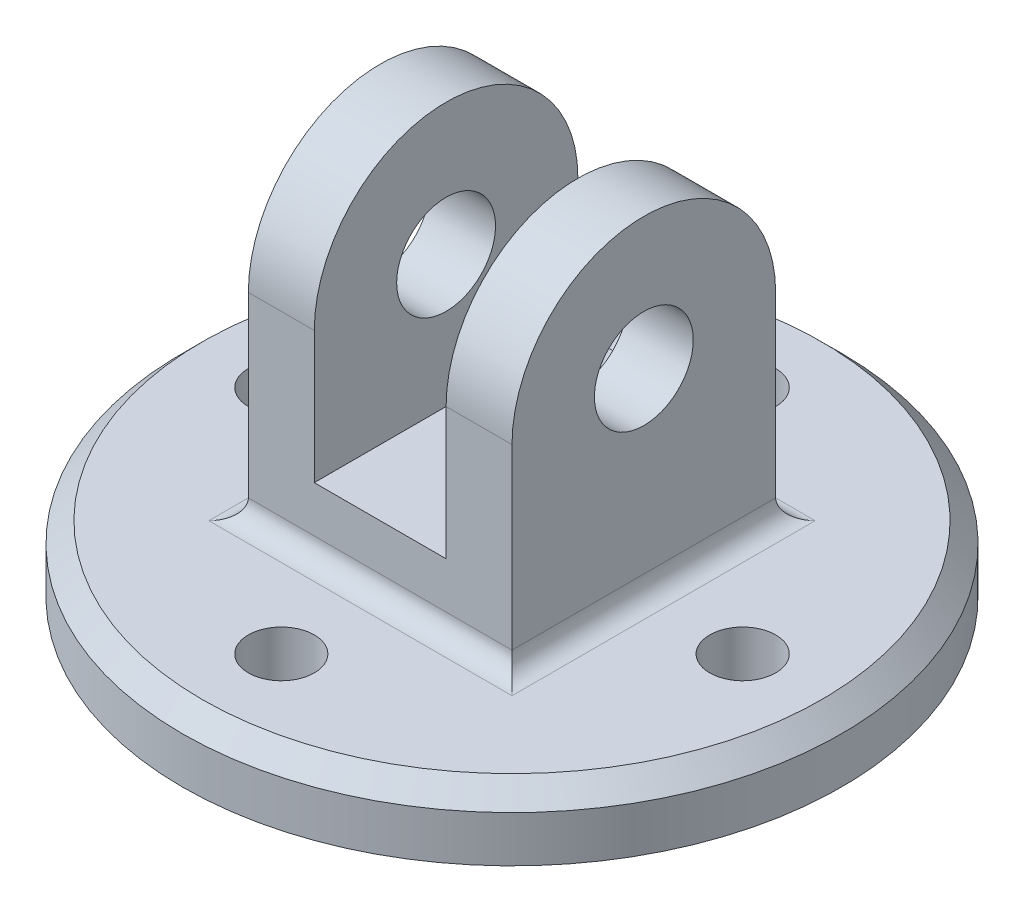
ISO-10303-21;
HEADER;
FILE_DESCRIPTION(('STEP AP214'),'2;1');
FILE_NAME('part.step','',(''),(''),'','','');
FILE_SCHEMA(('AUTOMOTIVE_DESIGN { 1 0 10303 214 1 1 1 1 }'));
ENDSEC;
DATA;
#1=APPLICATION_CONTEXT('core data for automotive mechanical design processes');
#2=APPLICATION_PROTOCOL_DEFINITION('international standard','automotive_design',2000,#1);
#3=PRODUCT_CONTEXT('',#1,'mechanical');
#4=PRODUCT('Part','Part','',(#3));
#5=PRODUCT_RELATED_PRODUCT_CATEGORY('part','',(#4));
#6=PRODUCT_DEFINITION_FORMATION('','',#4);
#7=PRODUCT_DEFINITION_CONTEXT('part definition',#1,'design');
#8=PRODUCT_DEFINITION('design','',#6,#7);
#9=PRODUCT_DEFINITION_SHAPE('','',#8);
#10=(LENGTH_UNIT() NAMED_UNIT(*) SI_UNIT(.MILLI.,.METRE.));
#11=(NAMED_UNIT(*) PLANE_ANGLE_UNIT() SI_UNIT($,.RADIAN.));
#12=(NAMED_UNIT(*) SI_UNIT($,.STERADIAN.) SOLID_ANGLE_UNIT());
#13=UNCERTAINTY_MEASURE_WITH_UNIT(LENGTH_MEASURE(1.E-05),#10,'distance_accuracy_value','');
#14=(GEOMETRIC_REPRESENTATION_CONTEXT(3) GLOBAL_UNCERTAINTY_ASSIGNED_CONTEXT((#13)) GLOBAL_UNIT_ASSIGNED_CONTEXT((#10,
#11,#12)) REPRESENTATION_CONTEXT('',''));
#15=CARTESIAN_POINT('',(0.,0.,0.));
#16=DIRECTION('',(0.,0.,1.));
#17=DIRECTION('',(1.,0.,0.));
#18=AXIS2_PLACEMENT_3D('',#15,#16,#17);
#19=CARTESIAN_POINT('',(-12.7,50.8,0.));
#20=DIRECTION('',(-1.,0.,0.));
#21=DIRECTION('',(0.,0.,1.));
#22=AXIS2_PLACEMENT_3D('',#19,#20,#21);
#23=CYLINDRICAL_SURFACE('',#22,25.4);
#24=DIRECTION('',(-1.,0.,0.));
#25=VECTOR('',#24,1.);
#26=CARTESIAN_POINT('',(0.,50.8,25.4));
#27=LINE('',#26,#25);
#28=CARTESIAN_POINT('',(-12.7,50.8,25.4));
#29=VERTEX_POINT('',#28);
#30=CARTESIAN_POINT('',(-25.4,50.8,25.4));
#31=VERTEX_POINT('',#30);
#32=EDGE_CURVE('E155',#29,#31,#27,.T.);
#33=ORIENTED_EDGE('',*,*,#32,.F.);
#34=CARTESIAN_POINT('',(-12.7,50.8,0.));
#35=DIRECTION('',(-1.,0.,0.));
#36=DIRECTION('',(0.,0.,1.));
#37=AXIS2_PLACEMENT_3D('',#34,#35,#36);
#38=CIRCLE('',#37,25.4);
#39=CARTESIAN_POINT('',(-12.7,50.8,-25.4));
#40=VERTEX_POINT('',#39);
#41=EDGE_CURVE('E161',#40,#29,#38,.F.);
#42=ORIENTED_EDGE('',*,*,#41,.F.);
#43=DIRECTION('',(1.,0.,0.));
#44=VECTOR('',#43,1.);
#45=CARTESIAN_POINT('',(-12.7,50.8,-25.4));
#46=LINE('',#45,#44);
#47=CARTESIAN_POINT('',(-25.4,50.8,-25.4));
#48=VERTEX_POINT('',#47);
#49=EDGE_CURVE('E158',#48,#40,#46,.T.);
#50=ORIENTED_EDGE('',*,*,#49,.F.);
#51=CARTESIAN_POINT('',(-25.4,50.8,0.));
#52=DIRECTION('',(1.,0.,0.));
#53=DIRECTION('',(0.,1.,0.));
#54=AXIS2_PLACEMENT_3D('',#51,#52,#53);
#55=CIRCLE('',#54,25.4);
#56=EDGE_CURVE('E163',#31,#48,#55,.F.);
#57=ORIENTED_EDGE('',*,*,#56,.F.);
#58=EDGE_LOOP('',(#33,#42,#50,#57));
#59=FACE_BOUND('',#58,.T.);
#60=ADVANCED_FACE('F34',(#59),#23,.T.);
#61=CARTESIAN_POINT('',(25.4,50.8,0.));
#62=DIRECTION('',(-1.,0.,0.));
#63=DIRECTION('',(0.,0.,1.));
#64=AXIS2_PLACEMENT_3D('',#61,#62,#63);
#65=CYLINDRICAL_SURFACE('',#64,25.4);
#66=DIRECTION('',(-1.,0.,0.));
#67=VECTOR('',#66,1.);
#68=CARTESIAN_POINT('',(0.,50.8,25.4));
#69=LINE('',#68,#67);
#70=CARTESIAN_POINT('',(25.4,50.8,25.4));
#71=VERTEX_POINT('',#70);
#72=CARTESIAN_POINT('',(12.7,50.8,25.4));
#73=VERTEX_POINT('',#72);
#74=EDGE_CURVE('E119',#71,#73,#69,.T.);
#75=ORIENTED_EDGE('',*,*,#74,.F.);
#76=CARTESIAN_POINT('',(25.4,50.8,0.));
#77=DIRECTION('',(-1.,0.,0.));
#78=DIRECTION('',(0.,-1.,0.));
#79=AXIS2_PLACEMENT_3D('',#76,#77,#78);
#80=CIRCLE('',#79,25.4);
#81=CARTESIAN_POINT('',(25.4,50.8,-25.4));
#82=VERTEX_POINT('',#81);
#83=EDGE_CURVE('E152',#82,#71,#80,.F.);
#84=ORIENTED_EDGE('',*,*,#83,.F.);
#85=DIRECTION('',(1.,0.,0.));
#86=VECTOR('',#85,1.);
#87=CARTESIAN_POINT('',(25.4,50.8,-25.4));
#88=LINE('',#87,#86);
#89=CARTESIAN_POINT('',(12.7,50.8,-25.4));
#90=VERTEX_POINT('',#89);
#91=EDGE_CURVE('E149',#90,#82,#88,.T.);
#92=ORIENTED_EDGE('',*,*,#91,.F.);
#93=CARTESIAN_POINT('',(12.7,50.8,0.));
#94=DIRECTION('',(1.,0.,0.));
#95=DIRECTION('',(0.,0.,-1.));
#96=AXIS2_PLACEMENT_3D('',#93,#94,#95);
#97=CIRCLE('',#96,25.4);
#98=EDGE_CURVE('E147',#73,#90,#97,.F.);
#99=ORIENTED_EDGE('',*,*,#98,.F.);
#100=EDGE_LOOP('',(#75,#84,#92,#99));
#101=FACE_BOUND('',#100,.T.);
#102=ADVANCED_FACE('F213',(#101),#65,.T.);
#103=CARTESIAN_POINT('',(0.,12.7,0.));
#104=DIRECTION('',(0.,1.,0.));
#105=DIRECTION('',(0.,0.,1.));
#106=AXIS2_PLACEMENT_3D('',#103,#104,#105);
#107=PLANE('',#106);
#108=CARTESIAN_POINT('',(0.,12.7,0.));
#109=DIRECTION('',(0.,1.,0.));
#110=DIRECTION('',(0.,0.,1.));
#111=AXIS2_PLACEMENT_3D('',#108,#109,#110);
#112=CIRCLE('',#111,59.69);
#113=CARTESIAN_POINT('',(0.,12.7,59.69));
#114=VERTEX_POINT('',#113);
#115=EDGE_CURVE('E42',#114,#114,#112,.T.);
#116=ORIENTED_EDGE('',*,*,#115,.T.);
#117=EDGE_LOOP('',(#116));
#118=FACE_BOUND('',#117,.T.);
#119=DIRECTION('',(0.,0.,-1.));
#120=VECTOR('',#119,1.);
#121=CARTESIAN_POINT('',(-29.21,12.7,0.));
#122=LINE('',#121,#120);
#123=CARTESIAN_POINT('',(-29.21,12.7,29.21));
#124=VERTEX_POINT('',#123);
#125=CARTESIAN_POINT('',(-29.21,12.7,-29.21));
#126=VERTEX_POINT('',#125);
#127=EDGE_CURVE('E174',#124,#126,#122,.T.);
#128=ORIENTED_EDGE('',*,*,#127,.T.);
#129=DIRECTION('',(1.,0.,0.));
#130=VECTOR('',#129,1.);
#131=CARTESIAN_POINT('',(25.4,12.7,-29.21));
#132=LINE('',#131,#130);
#133=CARTESIAN_POINT('',(29.21,12.7,-29.21));
#134=VERTEX_POINT('',#133);
#135=EDGE_CURVE('E176',#126,#134,#132,.T.);
#136=ORIENTED_EDGE('',*,*,#135,.T.);
#137=DIRECTION('',(0.,0.,-1.));
#138=VECTOR('',#137,1.);
#139=CARTESIAN_POINT('',(29.21,12.7,0.));
#140=LINE('',#139,#138);
#141=CARTESIAN_POINT('',(29.21,12.7,29.21));
#142=VERTEX_POINT('',#141);
#143=EDGE_CURVE('E172',#134,#142,#140,.F.);
#144=ORIENTED_EDGE('',*,*,#143,.T.);
#145=DIRECTION('',(1.,0.,0.));
#146=VECTOR('',#145,1.);
#147=CARTESIAN_POINT('',(0.,12.7,29.21));
#148=LINE('',#147,#146);
#149=EDGE_CURVE('E165',#142,#124,#148,.F.);
#150=ORIENTED_EDGE('',*,*,#149,.T.);
#151=EDGE_LOOP('',(#128,#136,#144,#150));
#152=FACE_BOUND('',#151,.T.);
#153=CARTESIAN_POINT('',(-44.45,12.7,-1.55196345511577E-13));
#154=DIRECTION('',(0.,1.,0.));
#155=DIRECTION('',(0.,0.,1.));
#156=AXIS2_PLACEMENT_3D('',#153,#154,#155);
#157=CIRCLE('',#156,6.35);
#158=CARTESIAN_POINT('',(-44.45,12.7,6.34999999999985));
#159=VERTEX_POINT('',#158);
#160=EDGE_CURVE('E269',#159,#159,#157,.T.);
#161=ORIENTED_EDGE('',*,*,#160,.F.);
#162=EDGE_LOOP('',(#161));
#163=FACE_BOUND('',#162,.T.);
#164=CARTESIAN_POINT('',(3.10392691023155E-13,12.7,-44.45));
#165=DIRECTION('',(0.,1.,0.));
#166=DIRECTION('',(0.,0.,1.));
#167=AXIS2_PLACEMENT_3D('',#164,#165,#166);
#168=CIRCLE('',#167,6.35);
#169=CARTESIAN_POINT('',(3.10392691023155E-13,12.7,-38.1));
#170=VERTEX_POINT('',#169);
#171=EDGE_CURVE('E273',#170,#170,#168,.T.);
#172=ORIENTED_EDGE('',*,*,#171,.F.);
#173=EDGE_LOOP('',(#172));
#174=FACE_BOUND('',#173,.T.);
#175=CARTESIAN_POINT('',(44.45,12.7,4.65589036534732E-13));
#176=DIRECTION('',(0.,1.,0.));
#177=DIRECTION('',(0.,0.,1.));
#178=AXIS2_PLACEMENT_3D('',#175,#176,#177);
#179=CIRCLE('',#178,6.35);
#180=CARTESIAN_POINT('',(44.45,12.7,6.35000000000047));
#181=VERTEX_POINT('',#180);
#182=EDGE_CURVE('E195',#181,#181,#179,.T.);
#183=ORIENTED_EDGE('',*,*,#182,.F.);
#184=EDGE_LOOP('',(#183));
#185=FACE_BOUND('',#184,.T.);
#186=CARTESIAN_POINT('',(0.,12.7,44.45));
#187=DIRECTION('',(0.,1.,0.));
#188=DIRECTION('',(0.,0.,1.));
#189=AXIS2_PLACEMENT_3D('',#186,#187,#188);
#190=CIRCLE('',#189,6.35);
#191=CARTESIAN_POINT('',(0.,12.7,50.8));
#192=VERTEX_POINT('',#191);
#193=EDGE_CURVE('E279',#192,#192,#190,.T.);
#194=ORIENTED_EDGE('',*,*,#193,.F.);
#195=EDGE_LOOP('',(#194));
#196=FACE_BOUND('',#195,.T.);
#197=ADVANCED_FACE('F199',(#118,#152,#163,#174,#185,#196),#107,.T.);
#198=CARTESIAN_POINT('',(0.,12.7,0.));
#199=DIRECTION('',(0.,-1.,0.));
#200=DIRECTION('',(0.,0.,-1.));
#201=AXIS2_PLACEMENT_3D('',#198,#199,#200);
#202=CYLINDRICAL_SURFACE('',#201,63.5);
#203=CARTESIAN_POINT('',(0.,8.88999999999998,0.));
#204=DIRECTION('',(0.,1.,0.));
#205=DIRECTION('',(0.,0.,1.));
#206=AXIS2_PLACEMENT_3D('',#203,#204,#205);
#207=CIRCLE('',#206,63.5);
#208=CARTESIAN_POINT('',(0.,8.88999999999998,63.5));
#209=VERTEX_POINT('',#208);
#210=EDGE_CURVE('E11',#209,#209,#207,.F.);
#211=ORIENTED_EDGE('',*,*,#210,.T.);
#212=EDGE_LOOP('',(#211));
#213=FACE_BOUND('',#212,.T.);
#214=CARTESIAN_POINT('',(0.,0.,0.));
#215=DIRECTION('',(0.,1.,0.));
#216=DIRECTION('',(0.,0.,1.));
#217=AXIS2_PLACEMENT_3D('',#214,#215,#216);
#218=CIRCLE('',#217,63.5);
#219=CARTESIAN_POINT('',(0.,0.,63.5));
#220=VERTEX_POINT('',#219);
#221=EDGE_CURVE('E138',#220,#220,#218,.T.);
#222=ORIENTED_EDGE('',*,*,#221,.T.);
#223=EDGE_LOOP('',(#222));
#224=FACE_BOUND('',#223,.T.);
#225=ADVANCED_FACE('F264',(#213,#224),#202,.T.);
#226=CARTESIAN_POINT('',(0.,0.,0.));
#227=DIRECTION('',(0.,1.,0.));
#228=DIRECTION('',(0.,0.,1.));
#229=AXIS2_PLACEMENT_3D('',#226,#227,#228);
#230=PLANE('',#229);
#231=CARTESIAN_POINT('',(-44.45,0.,-1.55196345511577E-13));
#232=DIRECTION('',(0.,1.,0.));
#233=DIRECTION('',(0.,0.,1.));
#234=AXIS2_PLACEMENT_3D('',#231,#232,#233);
#235=CIRCLE('',#234,6.35);
#236=CARTESIAN_POINT('',(-44.45,0.,6.34999999999985));
#237=VERTEX_POINT('',#236);
#238=EDGE_CURVE('E281',#237,#237,#235,.T.);
#239=ORIENTED_EDGE('',*,*,#238,.T.);
#240=EDGE_LOOP('',(#239));
#241=FACE_BOUND('',#240,.T.);
#242=CARTESIAN_POINT('',(3.10392691023155E-13,0.,-44.45));
#243=DIRECTION('',(0.,1.,0.));
#244=DIRECTION('',(0.,0.,1.));
#245=AXIS2_PLACEMENT_3D('',#242,#243,#244);
#246=CIRCLE('',#245,6.35);
#247=CARTESIAN_POINT('',(3.10392691023155E-13,0.,-38.1));
#248=VERTEX_POINT('',#247);
#249=EDGE_CURVE('E495',#248,#248,#246,.T.);
#250=ORIENTED_EDGE('',*,*,#249,.T.);
#251=EDGE_LOOP('',(#250));
#252=FACE_BOUND('',#251,.T.);
#253=CARTESIAN_POINT('',(44.45,0.,4.65589036534732E-13));
#254=DIRECTION('',(0.,1.,0.));
#255=DIRECTION('',(0.,0.,1.));
#256=AXIS2_PLACEMENT_3D('',#253,#254,#255);
#257=CIRCLE('',#256,6.35);
#258=CARTESIAN_POINT('',(44.45,0.,6.35000000000047));
#259=VERTEX_POINT('',#258);
#260=EDGE_CURVE('E496',#259,#259,#257,.T.);
#261=ORIENTED_EDGE('',*,*,#260,.T.);
#262=EDGE_LOOP('',(#261));
#263=FACE_BOUND('',#262,.T.);
#264=CARTESIAN_POINT('',(0.,0.,44.45));
#265=DIRECTION('',(0.,1.,0.));
#266=DIRECTION('',(0.,0.,1.));
#267=AXIS2_PLACEMENT_3D('',#264,#265,#266);
#268=CIRCLE('',#267,6.35);
#269=CARTESIAN_POINT('',(0.,0.,50.8));
#270=VERTEX_POINT('',#269);
#271=EDGE_CURVE('E170',#270,#270,#268,.T.);
#272=ORIENTED_EDGE('',*,*,#271,.T.);
#273=EDGE_LOOP('',(#272));
#274=FACE_BOUND('',#273,.T.);
#275=ORIENTED_EDGE('',*,*,#221,.F.);
#276=EDGE_LOOP('',(#275));
#277=FACE_BOUND('',#276,.T.);
#278=ADVANCED_FACE('F325',(#241,#252,#263,#274,#277),#230,.F.);
#279=CARTESIAN_POINT('',(12.7,25.4,25.4));
#280=DIRECTION('',(1.,0.,0.));
#281=DIRECTION('',(0.,0.,-1.));
#282=AXIS2_PLACEMENT_3D('',#279,#280,#281);
#283=PLANE('',#282);
#284=CARTESIAN_POINT('',(12.7,50.8,0.));
#285=DIRECTION('',(1.,0.,0.));
#286=DIRECTION('',(0.,0.,-1.));
#287=AXIS2_PLACEMENT_3D('',#284,#285,#286);
#288=CIRCLE('',#287,9.525);
#289=CARTESIAN_POINT('',(12.7,50.8,-9.525));
#290=VERTEX_POINT('',#289);
#291=EDGE_CURVE('E294',#290,#290,#288,.T.);
#292=ORIENTED_EDGE('',*,*,#291,.T.);
#293=EDGE_LOOP('',(#292));
#294=FACE_BOUND('',#293,.T.);
#295=DIRECTION('',(0.,-1.,0.));
#296=VECTOR('',#295,1.);
#297=CARTESIAN_POINT('',(12.7,25.4,25.4));
#298=LINE('',#297,#296);
#299=CARTESIAN_POINT('',(12.7,25.4,25.4));
#300=VERTEX_POINT('',#299);
#301=EDGE_CURVE('E112',#73,#300,#298,.T.);
#302=ORIENTED_EDGE('',*,*,#301,.F.);
#303=ORIENTED_EDGE('',*,*,#98,.T.);
#304=DIRECTION('',(0.,-1.,0.));
#305=VECTOR('',#304,1.);
#306=CARTESIAN_POINT('',(12.7,25.4,-25.4));
#307=LINE('',#306,#305);
#308=CARTESIAN_POINT('',(12.7,25.4,-25.4));
#309=VERTEX_POINT('',#308);
#310=EDGE_CURVE('E136',#90,#309,#307,.T.);
#311=ORIENTED_EDGE('',*,*,#310,.T.);
#312=DIRECTION('',(0.,0.,-1.));
#313=VECTOR('',#312,1.);
#314=CARTESIAN_POINT('',(12.7,25.4,25.4));
#315=LINE('',#314,#313);
#316=EDGE_CURVE('E128',#300,#309,#315,.T.);
#317=ORIENTED_EDGE('',*,*,#316,.F.);
#318=EDGE_LOOP('',(#302,#303,#311,#317));
#319=FACE_BOUND('',#318,.T.);
#320=ADVANCED_FACE('F134',(#294,#319),#283,.F.);
#321=CARTESIAN_POINT('',(-12.7,25.4,25.4));
#322=DIRECTION('',(0.,-1.,0.));
#323=DIRECTION('',(0.,0.,-1.));
#324=AXIS2_PLACEMENT_3D('',#321,#322,#323);
#325=PLANE('',#324);
#326=DIRECTION('',(-1.,0.,0.));
#327=VECTOR('',#326,1.);
#328=CARTESIAN_POINT('',(-12.7,25.4,-25.4));
#329=LINE('',#328,#327);
#330=CARTESIAN_POINT('',(-12.7,25.4,-25.4));
#331=VERTEX_POINT('',#330);
#332=EDGE_CURVE('E302',#309,#331,#329,.T.);
#333=ORIENTED_EDGE('',*,*,#332,.T.);
#334=DIRECTION('',(0.,0.,-1.));
#335=VECTOR('',#334,1.);
#336=CARTESIAN_POINT('',(-12.7,25.4,25.4));
#337=LINE('',#336,#335);
#338=CARTESIAN_POINT('',(-12.7,25.4,25.4));
#339=VERTEX_POINT('',#338);
#340=EDGE_CURVE('E130',#339,#331,#337,.T.);
#341=ORIENTED_EDGE('',*,*,#340,.F.);
#342=DIRECTION('',(-1.,0.,0.));
#343=VECTOR('',#342,1.);
#344=CARTESIAN_POINT('',(-12.7,25.4,25.4));
#345=LINE('',#344,#343);
#346=EDGE_CURVE('E116',#300,#339,#345,.T.);
#347=ORIENTED_EDGE('',*,*,#346,.F.);
#348=ORIENTED_EDGE('',*,*,#316,.T.);
#349=EDGE_LOOP('',(#333,#341,#347,#348));
#350=FACE_BOUND('',#349,.T.);
#351=ADVANCED_FACE('F127',(#350),#325,.F.);
#352=CARTESIAN_POINT('',(-12.7,25.4,25.4));
#353=DIRECTION('',(-1.,0.,0.));
#354=DIRECTION('',(0.,0.,1.));
#355=AXIS2_PLACEMENT_3D('',#352,#353,#354);
#356=PLANE('',#355);
#357=CARTESIAN_POINT('',(-12.7,50.8,0.));
#358=DIRECTION('',(-1.,0.,0.));
#359=DIRECTION('',(0.,0.,1.));
#360=AXIS2_PLACEMENT_3D('',#357,#358,#359);
#361=CIRCLE('',#360,9.525);
#362=CARTESIAN_POINT('',(-12.7,50.8,9.525));
#363=VERTEX_POINT('',#362);
#364=EDGE_CURVE('E291',#363,#363,#361,.T.);
#365=ORIENTED_EDGE('',*,*,#364,.T.);
#366=EDGE_LOOP('',(#365));
#367=FACE_BOUND('',#366,.T.);
#368=DIRECTION('',(0.,1.,0.));
#369=VECTOR('',#368,1.);
#370=CARTESIAN_POINT('',(-12.7,25.4,-25.4));
#371=LINE('',#370,#369);
#372=EDGE_CURVE('E304',#331,#40,#371,.T.);
#373=ORIENTED_EDGE('',*,*,#372,.T.);
#374=ORIENTED_EDGE('',*,*,#41,.T.);
#375=DIRECTION('',(0.,1.,0.));
#376=VECTOR('',#375,1.);
#377=CARTESIAN_POINT('',(-12.7,25.4,25.4));
#378=LINE('',#377,#376);
#379=EDGE_CURVE('E132',#339,#29,#378,.T.);
#380=ORIENTED_EDGE('',*,*,#379,.F.);
#381=ORIENTED_EDGE('',*,*,#340,.T.);
#382=EDGE_LOOP('',(#373,#374,#380,#381));
#383=FACE_BOUND('',#382,.T.);
#384=ADVANCED_FACE('F311',(#367,#383),#356,.F.);
#385=CARTESIAN_POINT('',(-25.4,76.2,25.4));
#386=DIRECTION('',(1.,0.,0.));
#387=DIRECTION('',(0.,1.,0.));
#388=AXIS2_PLACEMENT_3D('',#385,#386,#387);
#389=PLANE('',#388);
#390=CARTESIAN_POINT('',(-25.4,50.8,0.));
#391=DIRECTION('',(1.,0.,0.));
#392=DIRECTION('',(0.,1.,0.));
#393=AXIS2_PLACEMENT_3D('',#390,#391,#392);
#394=CIRCLE('',#393,9.525);
#395=CARTESIAN_POINT('',(-25.4,60.325,0.));
#396=VERTEX_POINT('',#395);
#397=EDGE_CURVE('E169',#396,#396,#394,.T.);
#398=ORIENTED_EDGE('',*,*,#397,.T.);
#399=EDGE_LOOP('',(#398));
#400=FACE_BOUND('',#399,.T.);
#401=DIRECTION('',(0.,-1.,0.));
#402=VECTOR('',#401,1.);
#403=CARTESIAN_POINT('',(-25.4,76.2,-25.4));
#404=LINE('',#403,#402);
#405=CARTESIAN_POINT('',(-25.4,16.51,-25.4));
#406=VERTEX_POINT('',#405);
#407=EDGE_CURVE('E258',#48,#406,#404,.T.);
#408=ORIENTED_EDGE('',*,*,#407,.T.);
#409=DIRECTION('',(0.,0.,-1.));
#410=VECTOR('',#409,1.);
#411=CARTESIAN_POINT('',(-25.4,16.51,25.4));
#412=LINE('',#411,#410);
#413=CARTESIAN_POINT('',(-25.4,16.51,25.4));
#414=VERTEX_POINT('',#413);
#415=EDGE_CURVE('E57',#406,#414,#412,.F.);
#416=ORIENTED_EDGE('',*,*,#415,.T.);
#417=DIRECTION('',(0.,-1.,0.));
#418=VECTOR('',#417,1.);
#419=CARTESIAN_POINT('',(-25.4,76.2,25.4));
#420=LINE('',#419,#418);
#421=EDGE_CURVE('E298',#31,#414,#420,.T.);
#422=ORIENTED_EDGE('',*,*,#421,.F.);
#423=ORIENTED_EDGE('',*,*,#56,.T.);
#424=EDGE_LOOP('',(#408,#416,#422,#423));
#425=FACE_BOUND('',#424,.T.);
#426=ADVANCED_FACE('F307',(#400,#425),#389,.F.);
#427=CARTESIAN_POINT('',(25.4,76.2,25.4));
#428=DIRECTION('',(-1.,0.,0.));
#429=DIRECTION('',(0.,-1.,0.));
#430=AXIS2_PLACEMENT_3D('',#427,#428,#429);
#431=PLANE('',#430);
#432=CARTESIAN_POINT('',(25.4,50.8,0.));
#433=DIRECTION('',(-1.,0.,0.));
#434=DIRECTION('',(0.,-1.,0.));
#435=AXIS2_PLACEMENT_3D('',#432,#433,#434);
#436=CIRCLE('',#435,9.525);
#437=CARTESIAN_POINT('',(25.4,41.275,0.));
#438=VERTEX_POINT('',#437);
#439=EDGE_CURVE('E166',#438,#438,#436,.T.);
#440=ORIENTED_EDGE('',*,*,#439,.T.);
#441=EDGE_LOOP('',(#440));
#442=FACE_BOUND('',#441,.T.);
#443=DIRECTION('',(0.,1.,0.));
#444=VECTOR('',#443,1.);
#445=CARTESIAN_POINT('',(25.4,76.2,25.4));
#446=LINE('',#445,#444);
#447=CARTESIAN_POINT('',(25.4,16.51,25.4));
#448=VERTEX_POINT('',#447);
#449=EDGE_CURVE('E142',#448,#71,#446,.T.);
#450=ORIENTED_EDGE('',*,*,#449,.F.);
#451=DIRECTION('',(0.,0.,-1.));
#452=VECTOR('',#451,1.);
#453=CARTESIAN_POINT('',(25.4,16.51,25.4));
#454=LINE('',#453,#452);
#455=CARTESIAN_POINT('',(25.4,16.51,-25.4));
#456=VERTEX_POINT('',#455);
#457=EDGE_CURVE('E183',#448,#456,#454,.T.);
#458=ORIENTED_EDGE('',*,*,#457,.T.);
#459=DIRECTION('',(0.,1.,0.));
#460=VECTOR('',#459,1.);
#461=CARTESIAN_POINT('',(25.4,76.2,-25.4));
#462=LINE('',#461,#460);
#463=EDGE_CURVE('E123',#456,#82,#462,.T.);
#464=ORIENTED_EDGE('',*,*,#463,.T.);
#465=ORIENTED_EDGE('',*,*,#83,.T.);
#466=EDGE_LOOP('',(#450,#458,#464,#465));
#467=FACE_BOUND('',#466,.T.);
#468=ADVANCED_FACE('F252',(#442,#467),#431,.F.);
#469=CARTESIAN_POINT('',(0.,0.,25.4));
#470=DIRECTION('',(0.,0.,-1.));
#471=DIRECTION('',(-1.,0.,0.));
#472=AXIS2_PLACEMENT_3D('',#469,#470,#471);
#473=PLANE('',#472);
#474=ORIENTED_EDGE('',*,*,#421,.T.);
#475=DIRECTION('',(1.,0.,0.));
#476=VECTOR('',#475,1.);
#477=CARTESIAN_POINT('',(0.,16.51,25.4));
#478=LINE('',#477,#476);
#479=EDGE_CURVE('E49',#414,#448,#478,.T.);
#480=ORIENTED_EDGE('',*,*,#479,.T.);
#481=ORIENTED_EDGE('',*,*,#449,.T.);
#482=ORIENTED_EDGE('',*,*,#74,.T.);
#483=ORIENTED_EDGE('',*,*,#301,.T.);
#484=ORIENTED_EDGE('',*,*,#346,.T.);
#485=ORIENTED_EDGE('',*,*,#379,.T.);
#486=ORIENTED_EDGE('',*,*,#32,.T.);
#487=EDGE_LOOP('',(#474,#480,#481,#482,#483,#484,#485,#486));
#488=FACE_BOUND('',#487,.T.);
#489=ADVANCED_FACE('F114',(#488),#473,.F.);
#490=CARTESIAN_POINT('',(0.,0.,-25.4));
#491=DIRECTION('',(0.,0.,-1.));
#492=DIRECTION('',(-1.,0.,0.));
#493=AXIS2_PLACEMENT_3D('',#490,#491,#492);
#494=PLANE('',#493);
#495=ORIENTED_EDGE('',*,*,#463,.F.);
#496=DIRECTION('',(1.,0.,0.));
#497=VECTOR('',#496,1.);
#498=CARTESIAN_POINT('',(-25.4,16.51,-25.4));
#499=LINE('',#498,#497);
#500=EDGE_CURVE('E179',#456,#406,#499,.F.);
#501=ORIENTED_EDGE('',*,*,#500,.T.);
#502=ORIENTED_EDGE('',*,*,#407,.F.);
#503=ORIENTED_EDGE('',*,*,#49,.T.);
#504=ORIENTED_EDGE('',*,*,#372,.F.);
#505=ORIENTED_EDGE('',*,*,#332,.F.);
#506=ORIENTED_EDGE('',*,*,#310,.F.);
#507=ORIENTED_EDGE('',*,*,#91,.T.);
#508=EDGE_LOOP('',(#495,#501,#502,#503,#504,#505,#506,#507));
#509=FACE_BOUND('',#508,.T.);
#510=ADVANCED_FACE('F256',(#509),#494,.T.);
#511=CARTESIAN_POINT('',(-63.5,50.8,0.));
#512=DIRECTION('',(1.,0.,0.));
#513=DIRECTION('',(0.,0.,-1.));
#514=AXIS2_PLACEMENT_3D('',#511,#512,#513);
#515=CYLINDRICAL_SURFACE('',#514,9.525);
#516=ORIENTED_EDGE('',*,*,#439,.F.);
#517=EDGE_LOOP('',(#516));
#518=FACE_BOUND('',#517,.T.);
#519=ORIENTED_EDGE('',*,*,#291,.F.);
#520=EDGE_LOOP('',(#519));
#521=FACE_BOUND('',#520,.T.);
#522=ADVANCED_FACE('F370',(#518,#521),#515,.F.);
#523=ORIENTED_EDGE('',*,*,#397,.F.);
#524=EDGE_LOOP('',(#523));
#525=FACE_BOUND('',#524,.T.);
#526=ORIENTED_EDGE('',*,*,#364,.F.);
#527=EDGE_LOOP('',(#526));
#528=FACE_BOUND('',#527,.T.);
#529=ADVANCED_FACE('F376',(#525,#528),#515,.F.);
#530=CARTESIAN_POINT('',(0.,0.,44.45));
#531=DIRECTION('',(0.,1.,0.));
#532=DIRECTION('',(0.,0.,1.));
#533=AXIS2_PLACEMENT_3D('',#530,#531,#532);
#534=CYLINDRICAL_SURFACE('',#533,6.35);
#535=ORIENTED_EDGE('',*,*,#271,.F.);
#536=EDGE_LOOP('',(#535));
#537=FACE_BOUND('',#536,.T.);
#538=ORIENTED_EDGE('',*,*,#193,.T.);
#539=EDGE_LOOP('',(#538));
#540=FACE_BOUND('',#539,.T.);
#541=ADVANCED_FACE('F384',(#537,#540),#534,.F.);
#542=CARTESIAN_POINT('',(44.45,0.,4.65589036534732E-13));
#543=DIRECTION('',(0.,1.,0.));
#544=DIRECTION('',(0.,0.,1.));
#545=AXIS2_PLACEMENT_3D('',#542,#543,#544);
#546=CYLINDRICAL_SURFACE('',#545,6.35);
#547=ORIENTED_EDGE('',*,*,#260,.F.);
#548=EDGE_LOOP('',(#547));
#549=FACE_BOUND('',#548,.T.);
#550=ORIENTED_EDGE('',*,*,#182,.T.);
#551=EDGE_LOOP('',(#550));
#552=FACE_BOUND('',#551,.T.);
#553=ADVANCED_FACE('F391',(#549,#552),#546,.F.);
#554=CARTESIAN_POINT('',(3.10392691023155E-13,0.,-44.45));
#555=DIRECTION('',(0.,1.,0.));
#556=DIRECTION('',(0.,0.,1.));
#557=AXIS2_PLACEMENT_3D('',#554,#555,#556);
#558=CYLINDRICAL_SURFACE('',#557,6.35);
#559=ORIENTED_EDGE('',*,*,#249,.F.);
#560=EDGE_LOOP('',(#559));
#561=FACE_BOUND('',#560,.T.);
#562=ORIENTED_EDGE('',*,*,#171,.T.);
#563=EDGE_LOOP('',(#562));
#564=FACE_BOUND('',#563,.T.);
#565=ADVANCED_FACE('F241',(#561,#564),#558,.F.);
#566=CARTESIAN_POINT('',(-44.45,0.,-1.55196345511577E-13));
#567=DIRECTION('',(0.,1.,0.));
#568=DIRECTION('',(0.,0.,1.));
#569=AXIS2_PLACEMENT_3D('',#566,#567,#568);
#570=CYLINDRICAL_SURFACE('',#569,6.35);
#571=ORIENTED_EDGE('',*,*,#238,.F.);
#572=EDGE_LOOP('',(#571));
#573=FACE_BOUND('',#572,.T.);
#574=ORIENTED_EDGE('',*,*,#160,.T.);
#575=EDGE_LOOP('',(#574));
#576=FACE_BOUND('',#575,.T.);
#577=ADVANCED_FACE('F236',(#573,#576),#570,.F.);
#578=CARTESIAN_POINT('',(0.,16.51,29.21));
#579=DIRECTION('',(1.,0.,0.));
#580=DIRECTION('',(0.,0.,-1.));
#581=AXIS2_PLACEMENT_3D('',#578,#579,#580);
#582=CYLINDRICAL_SURFACE('',#581,3.81);
#583=CARTESIAN_POINT('',(29.21,16.51,29.21));
#584=DIRECTION('',(0.707106781186547,0.,-0.707106781186547));
#585=DIRECTION('',(0.707106781186547,0.,0.707106781186547));
#586=AXIS2_PLACEMENT_3D('',#583,#584,#585);
#587=ELLIPSE('',#586,5.38815367264149,3.81);
#588=EDGE_CURVE('E190',#448,#142,#587,.F.);
#589=ORIENTED_EDGE('',*,*,#588,.F.);
#590=ORIENTED_EDGE('',*,*,#479,.F.);
#591=CARTESIAN_POINT('',(-29.21,16.51,29.21));
#592=DIRECTION('',(0.707106781186547,0.,0.707106781186547));
#593=DIRECTION('',(0.707106781186547,0.,-0.707106781186547));
#594=AXIS2_PLACEMENT_3D('',#591,#592,#593);
#595=ELLIPSE('',#594,5.38815367264149,3.81);
#596=EDGE_CURVE('E193',#124,#414,#595,.T.);
#597=ORIENTED_EDGE('',*,*,#596,.F.);
#598=ORIENTED_EDGE('',*,*,#149,.F.);
#599=EDGE_LOOP('',(#589,#590,#597,#598));
#600=FACE_BOUND('',#599,.T.);
#601=ADVANCED_FACE('F233',(#600),#582,.F.);
#602=CARTESIAN_POINT('',(-29.21,16.51,0.));
#603=DIRECTION('',(0.,0.,-1.));
#604=DIRECTION('',(-1.,0.,0.));
#605=AXIS2_PLACEMENT_3D('',#602,#603,#604);
#606=CYLINDRICAL_SURFACE('',#605,3.81);
#607=ORIENTED_EDGE('',*,*,#596,.T.);
#608=ORIENTED_EDGE('',*,*,#415,.F.);
#609=CARTESIAN_POINT('',(-29.21,16.51,-29.21));
#610=DIRECTION('',(0.707106781186547,0.,-0.707106781186547));
#611=DIRECTION('',(-0.707106781186547,0.,-0.707106781186547));
#612=AXIS2_PLACEMENT_3D('',#609,#610,#611);
#613=ELLIPSE('',#612,5.38815367264149,3.81);
#614=EDGE_CURVE('E188',#126,#406,#613,.F.);
#615=ORIENTED_EDGE('',*,*,#614,.F.);
#616=ORIENTED_EDGE('',*,*,#127,.F.);
#617=EDGE_LOOP('',(#607,#608,#615,#616));
#618=FACE_BOUND('',#617,.T.);
#619=ADVANCED_FACE('F230',(#618),#606,.F.);
#620=CARTESIAN_POINT('',(29.21,16.51,25.4));
#621=DIRECTION('',(0.,0.,-1.));
#622=DIRECTION('',(-1.,0.,0.));
#623=AXIS2_PLACEMENT_3D('',#620,#621,#622);
#624=CYLINDRICAL_SURFACE('',#623,3.81);
#625=ORIENTED_EDGE('',*,*,#588,.T.);
#626=ORIENTED_EDGE('',*,*,#143,.F.);
#627=CARTESIAN_POINT('',(29.21,16.51,-29.21));
#628=DIRECTION('',(-0.707106781186547,0.,-0.707106781186547));
#629=DIRECTION('',(0.707106781186547,0.,-0.707106781186547));
#630=AXIS2_PLACEMENT_3D('',#627,#628,#629);
#631=ELLIPSE('',#630,5.38815367264149,3.81);
#632=EDGE_CURVE('E186',#456,#134,#631,.F.);
#633=ORIENTED_EDGE('',*,*,#632,.F.);
#634=ORIENTED_EDGE('',*,*,#457,.F.);
#635=EDGE_LOOP('',(#625,#626,#633,#634));
#636=FACE_BOUND('',#635,.T.);
#637=ADVANCED_FACE('F208',(#636),#624,.F.);
#638=CARTESIAN_POINT('',(0.,16.51,-29.21));
#639=DIRECTION('',(-1.,0.,0.));
#640=DIRECTION('',(0.,0.,1.));
#641=AXIS2_PLACEMENT_3D('',#638,#639,#640);
#642=CYLINDRICAL_SURFACE('',#641,3.81);
#643=ORIENTED_EDGE('',*,*,#614,.T.);
#644=ORIENTED_EDGE('',*,*,#500,.F.);
#645=ORIENTED_EDGE('',*,*,#632,.T.);
#646=ORIENTED_EDGE('',*,*,#135,.F.);
#647=EDGE_LOOP('',(#643,#644,#645,#646));
#648=FACE_BOUND('',#647,.T.);
#649=ADVANCED_FACE('F203',(#648),#642,.F.);
#650=CARTESIAN_POINT('',(0.,12.7,0.));
#651=DIRECTION('',(0.,-1.,0.));
#652=DIRECTION('',(0.,0.,-1.));
#653=AXIS2_PLACEMENT_3D('',#650,#651,#652);
#654=CONICAL_SURFACE('',#653,59.69,0.78539816339745);
#655=ORIENTED_EDGE('',*,*,#210,.F.);
#656=EDGE_LOOP('',(#655));
#657=FACE_BOUND('',#656,.T.);
#658=ORIENTED_EDGE('',*,*,#115,.F.);
#659=EDGE_LOOP('',(#658));
#660=FACE_BOUND('',#659,.T.);
#661=ADVANCED_FACE('F36',(#657,#660),#654,.T.);
#662=CLOSED_SHELL('',(#60,#102,#197,#225,#278,#320,#351,#384,#426,#468,#489,#510,#522,#529,#541,
#553,#565,#577,#601,#619,#637,#649,#661));
#663=MANIFOLD_SOLID_BREP('B2',#662);
#664=ADVANCED_BREP_SHAPE_REPRESENTATION('',(#18,#663),#14);
#665=SHAPE_DEFINITION_REPRESENTATION(#9,#664);
ENDSEC;
END-ISO-10303-21;
